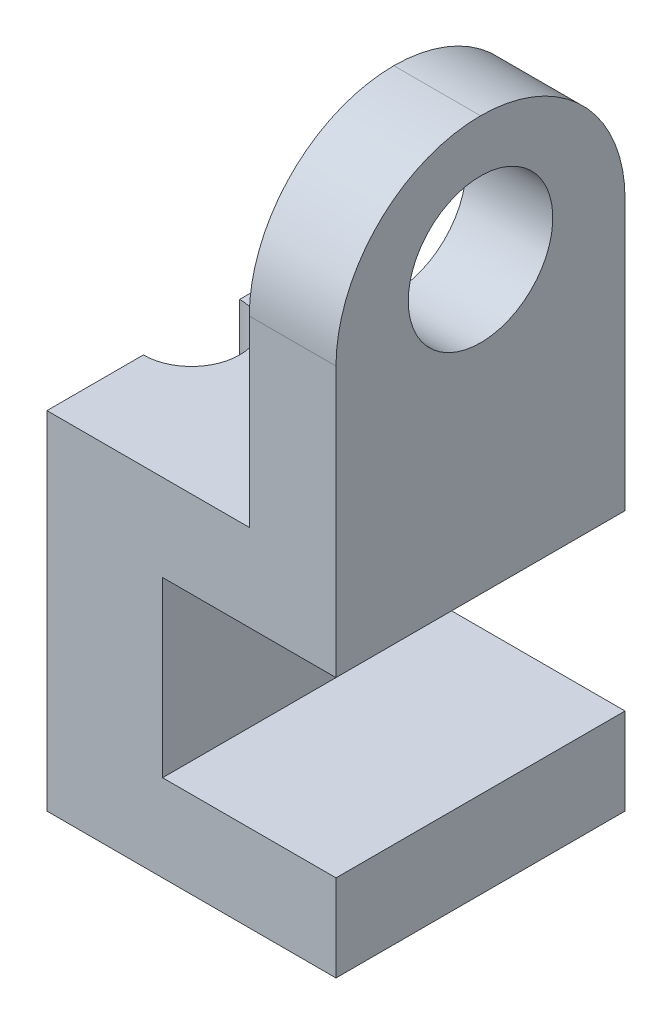
ISO-10303-21;
HEADER;
FILE_DESCRIPTION(('STEP AP214'),'2;1');
FILE_NAME('part.step','',(''),(''),'','','');
FILE_SCHEMA(('AUTOMOTIVE_DESIGN { 1 0 10303 214 1 1 1 1 }'));
ENDSEC;
DATA;
#1=APPLICATION_CONTEXT('core data for automotive mechanical design processes');
#2=APPLICATION_PROTOCOL_DEFINITION('international standard','automotive_design',2000,#1);
#3=PRODUCT_CONTEXT('',#1,'mechanical');
#4=PRODUCT('Part','Part','',(#3));
#5=PRODUCT_RELATED_PRODUCT_CATEGORY('part','',(#4));
#6=PRODUCT_DEFINITION_FORMATION('','',#4);
#7=PRODUCT_DEFINITION_CONTEXT('part definition',#1,'design');
#8=PRODUCT_DEFINITION('design','',#6,#7);
#9=PRODUCT_DEFINITION_SHAPE('','',#8);
#10=(LENGTH_UNIT() NAMED_UNIT(*) SI_UNIT(.MILLI.,.METRE.));
#11=(NAMED_UNIT(*) PLANE_ANGLE_UNIT() SI_UNIT($,.RADIAN.));
#12=(NAMED_UNIT(*) SI_UNIT($,.STERADIAN.) SOLID_ANGLE_UNIT());
#13=UNCERTAINTY_MEASURE_WITH_UNIT(LENGTH_MEASURE(1.E-05),#10,'distance_accuracy_value','');
#14=(GEOMETRIC_REPRESENTATION_CONTEXT(3) GLOBAL_UNCERTAINTY_ASSIGNED_CONTEXT((#13)) GLOBAL_UNIT_ASSIGNED_CONTEXT((#10,
#11,#12)) REPRESENTATION_CONTEXT('',''));
#15=CARTESIAN_POINT('',(0.,0.,0.));
#16=DIRECTION('',(0.,0.,1.));
#17=DIRECTION('',(1.,0.,0.));
#18=AXIS2_PLACEMENT_3D('',#15,#16,#17);
#19=CARTESIAN_POINT('',(0.,36.,0.));
#20=DIRECTION('',(0.,-1.,0.));
#21=DIRECTION('',(0.,0.,-1.));
#22=AXIS2_PLACEMENT_3D('',#19,#20,#21);
#23=PLANE('',#22);
#24=DIRECTION('',(0.,0.,1.));
#25=VECTOR('',#24,1.);
#26=CARTESIAN_POINT('',(19.7323943661972,36.,-30.));
#27=LINE('',#26,#25);
#28=CARTESIAN_POINT('',(19.7323943661972,36.,-30.));
#29=VERTEX_POINT('',#28);
#30=CARTESIAN_POINT('',(19.7323943661972,36.,0.));
#31=VERTEX_POINT('',#30);
#32=EDGE_CURVE('E142',#29,#31,#27,.T.);
#33=ORIENTED_EDGE('',*,*,#32,.F.);
#34=DIRECTION('',(-1.,0.,0.));
#35=VECTOR('',#34,1.);
#36=CARTESIAN_POINT('',(-1.26760563380282,36.,-30.));
#37=LINE('',#36,#35);
#38=CARTESIAN_POINT('',(-1.26760563380282,36.,-30.));
#39=VERTEX_POINT('',#38);
#40=EDGE_CURVE('E150',#29,#39,#37,.T.);
#41=ORIENTED_EDGE('',*,*,#40,.T.);
#42=DIRECTION('',(0.,0.,1.));
#43=VECTOR('',#42,1.);
#44=CARTESIAN_POINT('',(-1.26760563380282,36.,0.));
#45=LINE('',#44,#43);
#46=CARTESIAN_POINT('',(-1.26760563380282,36.,-20.));
#47=VERTEX_POINT('',#46);
#48=EDGE_CURVE('E151',#39,#47,#45,.T.);
#49=ORIENTED_EDGE('',*,*,#48,.T.);
#50=CARTESIAN_POINT('',(-1.26760563380282,36.,-15.));
#51=DIRECTION('',(0.,1.,0.));
#52=DIRECTION('',(0.,0.,1.));
#53=AXIS2_PLACEMENT_3D('',#50,#51,#52);
#54=CIRCLE('',#53,5.);
#55=CARTESIAN_POINT('',(-1.26760563380282,36.,-10.));
#56=VERTEX_POINT('',#55);
#57=EDGE_CURVE('E162',#56,#47,#54,.T.);
#58=ORIENTED_EDGE('',*,*,#57,.F.);
#59=CARTESIAN_POINT('',(-1.26760563380282,36.,0.));
#60=VERTEX_POINT('',#59);
#61=EDGE_CURVE('E149',#56,#60,#45,.T.);
#62=ORIENTED_EDGE('',*,*,#61,.T.);
#63=DIRECTION('',(1.,0.,0.));
#64=VECTOR('',#63,1.);
#65=CARTESIAN_POINT('',(-1.26760563380282,36.,0.));
#66=LINE('',#65,#64);
#67=EDGE_CURVE('E136',#60,#31,#66,.T.);
#68=ORIENTED_EDGE('',*,*,#67,.T.);
#69=EDGE_LOOP('',(#33,#41,#49,#58,#62,#68));
#70=FACE_BOUND('',#69,.T.);
#71=ADVANCED_FACE('F39',(#70),#23,.F.);
#72=CARTESIAN_POINT('',(-1.26760563380282,36.,0.));
#73=DIRECTION('',(1.,0.,0.));
#74=DIRECTION('',(0.,0.,-1.));
#75=AXIS2_PLACEMENT_3D('',#72,#73,#74);
#76=PLANE('',#75);
#77=DIRECTION('',(0.,0.,1.));
#78=VECTOR('',#77,1.);
#79=CARTESIAN_POINT('',(-1.26760563380282,0.,0.));
#80=LINE('',#79,#78);
#81=CARTESIAN_POINT('',(-1.26760563380282,0.,-30.));
#82=VERTEX_POINT('',#81);
#83=CARTESIAN_POINT('',(-1.26760563380282,0.,-20.));
#84=VERTEX_POINT('',#83);
#85=EDGE_CURVE('E205',#82,#84,#80,.T.);
#86=ORIENTED_EDGE('',*,*,#85,.T.);
#87=DIRECTION('',(0.,1.,0.));
#88=VECTOR('',#87,1.);
#89=CARTESIAN_POINT('',(-1.26760563380282,0.,-20.));
#90=LINE('',#89,#88);
#91=EDGE_CURVE('E170',#84,#47,#90,.T.);
#92=ORIENTED_EDGE('',*,*,#91,.T.);
#93=ORIENTED_EDGE('',*,*,#48,.F.);
#94=DIRECTION('',(0.,-1.,0.));
#95=VECTOR('',#94,1.);
#96=CARTESIAN_POINT('',(-1.26760563380282,36.,-30.));
#97=LINE('',#96,#95);
#98=EDGE_CURVE('E204',#39,#82,#97,.T.);
#99=ORIENTED_EDGE('',*,*,#98,.T.);
#100=EDGE_LOOP('',(#86,#92,#93,#99));
#101=FACE_BOUND('',#100,.T.);
#102=ADVANCED_FACE('F271',(#101),#76,.F.);
#103=CARTESIAN_POINT('',(28.7323943661972,36.,0.));
#104=DIRECTION('',(-1.,0.,0.));
#105=DIRECTION('',(0.,0.,1.));
#106=AXIS2_PLACEMENT_3D('',#103,#104,#105);
#107=PLANE('',#106);
#108=CARTESIAN_POINT('',(28.7323943661972,57.087838250565,-15.));
#109=DIRECTION('',(-1.,0.,0.));
#110=DIRECTION('',(0.,0.,1.));
#111=AXIS2_PLACEMENT_3D('',#108,#109,#110);
#112=CIRCLE('',#111,7.5);
#113=CARTESIAN_POINT('',(28.7323943661972,57.087838250565,-7.50000000000001));
#114=VERTEX_POINT('',#113);
#115=EDGE_CURVE('E156',#114,#114,#112,.T.);
#116=ORIENTED_EDGE('',*,*,#115,.T.);
#117=EDGE_LOOP('',(#116));
#118=FACE_BOUND('',#117,.T.);
#119=CARTESIAN_POINT('',(28.7323943661972,55.,-15.));
#120=DIRECTION('',(-1.,0.,0.));
#121=DIRECTION('',(0.,0.,1.));
#122=AXIS2_PLACEMENT_3D('',#119,#120,#121);
#123=CIRCLE('',#122,15.);
#124=CARTESIAN_POINT('',(28.7323943661972,55.,-30.));
#125=VERTEX_POINT('',#124);
#126=CARTESIAN_POINT('',(28.7323943661972,70.,-15.));
#127=VERTEX_POINT('',#126);
#128=EDGE_CURVE('E226',#125,#127,#123,.F.);
#129=ORIENTED_EDGE('',*,*,#128,.T.);
#130=CARTESIAN_POINT('',(28.7323943661972,55.,-15.));
#131=DIRECTION('',(-1.,0.,0.));
#132=DIRECTION('',(0.,0.,1.));
#133=AXIS2_PLACEMENT_3D('',#130,#131,#132);
#134=CIRCLE('',#133,15.);
#135=CARTESIAN_POINT('',(28.7323943661972,55.,0.));
#136=VERTEX_POINT('',#135);
#137=EDGE_CURVE('E228',#127,#136,#134,.F.);
#138=ORIENTED_EDGE('',*,*,#137,.T.);
#139=DIRECTION('',(0.,-1.,0.));
#140=VECTOR('',#139,1.);
#141=CARTESIAN_POINT('',(28.7323943661972,36.,0.));
#142=LINE('',#141,#140);
#143=CARTESIAN_POINT('',(28.7323943661972,27.,0.));
#144=VERTEX_POINT('',#143);
#145=EDGE_CURVE('E222',#136,#144,#142,.T.);
#146=ORIENTED_EDGE('',*,*,#145,.T.);
#147=DIRECTION('',(0.,0.,1.));
#148=VECTOR('',#147,1.);
#149=CARTESIAN_POINT('',(28.7323943661972,27.,-30.));
#150=LINE('',#149,#148);
#151=CARTESIAN_POINT('',(28.7323943661972,27.,-30.));
#152=VERTEX_POINT('',#151);
#153=EDGE_CURVE('E194',#152,#144,#150,.T.);
#154=ORIENTED_EDGE('',*,*,#153,.F.);
#155=DIRECTION('',(0.,-1.,0.));
#156=VECTOR('',#155,1.);
#157=CARTESIAN_POINT('',(28.7323943661972,36.,-30.));
#158=LINE('',#157,#156);
#159=EDGE_CURVE('E219',#125,#152,#158,.T.);
#160=ORIENTED_EDGE('',*,*,#159,.F.);
#161=EDGE_LOOP('',(#129,#138,#146,#154,#160));
#162=FACE_BOUND('',#161,.T.);
#163=ADVANCED_FACE('F234',(#118,#162),#107,.F.);
#164=ORIENTED_EDGE('',*,*,#61,.F.);
#165=DIRECTION('',(0.,1.,0.));
#166=VECTOR('',#165,1.);
#167=CARTESIAN_POINT('',(-1.26760563380282,0.,-10.));
#168=LINE('',#167,#166);
#169=CARTESIAN_POINT('',(-1.26760563380282,0.,-10.));
#170=VERTEX_POINT('',#169);
#171=EDGE_CURVE('E166',#56,#170,#168,.F.);
#172=ORIENTED_EDGE('',*,*,#171,.T.);
#173=CARTESIAN_POINT('',(-1.26760563380282,0.,0.));
#174=VERTEX_POINT('',#173);
#175=EDGE_CURVE('E193',#170,#174,#80,.T.);
#176=ORIENTED_EDGE('',*,*,#175,.T.);
#177=DIRECTION('',(0.,-1.,0.));
#178=VECTOR('',#177,1.);
#179=CARTESIAN_POINT('',(-1.26760563380282,36.,0.));
#180=LINE('',#179,#178);
#181=EDGE_CURVE('E224',#60,#174,#180,.T.);
#182=ORIENTED_EDGE('',*,*,#181,.F.);
#183=EDGE_LOOP('',(#164,#172,#176,#182));
#184=FACE_BOUND('',#183,.T.);
#185=ADVANCED_FACE('F274',(#184),#76,.F.);
#186=CARTESIAN_POINT('',(-1.26760563380282,36.,0.));
#187=DIRECTION('',(0.,0.,-1.));
#188=DIRECTION('',(-1.,0.,0.));
#189=AXIS2_PLACEMENT_3D('',#186,#187,#188);
#190=PLANE('',#189);
#191=ORIENTED_EDGE('',*,*,#145,.F.);
#192=DIRECTION('',(1.,0.,0.));
#193=VECTOR('',#192,1.);
#194=CARTESIAN_POINT('',(-1.26760563380282,55.,0.));
#195=LINE('',#194,#193);
#196=CARTESIAN_POINT('',(19.7323943661972,55.,0.));
#197=VERTEX_POINT('',#196);
#198=EDGE_CURVE('E139',#136,#197,#195,.F.);
#199=ORIENTED_EDGE('',*,*,#198,.T.);
#200=DIRECTION('',(0.,-1.,0.));
#201=VECTOR('',#200,1.);
#202=CARTESIAN_POINT('',(19.7323943661972,70.,0.));
#203=LINE('',#202,#201);
#204=EDGE_CURVE('E131',#197,#31,#203,.T.);
#205=ORIENTED_EDGE('',*,*,#204,.T.);
#206=ORIENTED_EDGE('',*,*,#67,.F.);
#207=ORIENTED_EDGE('',*,*,#181,.T.);
#208=DIRECTION('',(1.,0.,0.));
#209=VECTOR('',#208,1.);
#210=CARTESIAN_POINT('',(-1.26760563380282,0.,0.));
#211=LINE('',#210,#209);
#212=CARTESIAN_POINT('',(28.7323943661972,0.,0.));
#213=VERTEX_POINT('',#212);
#214=EDGE_CURVE('E208',#174,#213,#211,.T.);
#215=ORIENTED_EDGE('',*,*,#214,.T.);
#216=CARTESIAN_POINT('',(28.7323943661972,8.99999999999999,0.));
#217=VERTEX_POINT('',#216);
#218=EDGE_CURVE('E221',#217,#213,#142,.T.);
#219=ORIENTED_EDGE('',*,*,#218,.F.);
#220=DIRECTION('',(1.,0.,0.));
#221=VECTOR('',#220,1.);
#222=CARTESIAN_POINT('',(28.7323943661972,8.99999999999999,0.));
#223=LINE('',#222,#221);
#224=CARTESIAN_POINT('',(10.7323943661972,8.99999999999999,0.));
#225=VERTEX_POINT('',#224);
#226=EDGE_CURVE('E187',#225,#217,#223,.T.);
#227=ORIENTED_EDGE('',*,*,#226,.F.);
#228=DIRECTION('',(0.,-1.,0.));
#229=VECTOR('',#228,1.);
#230=CARTESIAN_POINT('',(10.7323943661972,8.99999999999999,0.));
#231=LINE('',#230,#229);
#232=CARTESIAN_POINT('',(10.7323943661972,27.,0.));
#233=VERTEX_POINT('',#232);
#234=EDGE_CURVE('E173',#233,#225,#231,.T.);
#235=ORIENTED_EDGE('',*,*,#234,.F.);
#236=DIRECTION('',(-1.,0.,0.));
#237=VECTOR('',#236,1.);
#238=CARTESIAN_POINT('',(28.7323943661972,27.,0.));
#239=LINE('',#238,#237);
#240=EDGE_CURVE('E178',#144,#233,#239,.T.);
#241=ORIENTED_EDGE('',*,*,#240,.F.);
#242=EDGE_LOOP('',(#191,#199,#205,#206,#207,#215,#219,#227,#235,#241));
#243=FACE_BOUND('',#242,.T.);
#244=ADVANCED_FACE('F134',(#243),#190,.F.);
#245=CARTESIAN_POINT('',(28.7323943661972,8.99999999999999,-30.));
#246=VERTEX_POINT('',#245);
#247=CARTESIAN_POINT('',(28.7323943661972,0.,-30.));
#248=VERTEX_POINT('',#247);
#249=EDGE_CURVE('E218',#246,#248,#158,.T.);
#250=ORIENTED_EDGE('',*,*,#249,.F.);
#251=DIRECTION('',(0.,0.,1.));
#252=VECTOR('',#251,1.);
#253=CARTESIAN_POINT('',(28.7323943661972,8.99999999999999,-30.));
#254=LINE('',#253,#252);
#255=EDGE_CURVE('E197',#246,#217,#254,.T.);
#256=ORIENTED_EDGE('',*,*,#255,.T.);
#257=ORIENTED_EDGE('',*,*,#218,.T.);
#258=DIRECTION('',(0.,0.,-1.));
#259=VECTOR('',#258,1.);
#260=CARTESIAN_POINT('',(28.7323943661972,0.,0.));
#261=LINE('',#260,#259);
#262=EDGE_CURVE('E211',#213,#248,#261,.T.);
#263=ORIENTED_EDGE('',*,*,#262,.T.);
#264=EDGE_LOOP('',(#250,#256,#257,#263));
#265=FACE_BOUND('',#264,.T.);
#266=ADVANCED_FACE('F260',(#265),#107,.F.);
#267=CARTESIAN_POINT('',(-1.26760563380282,36.,-30.));
#268=DIRECTION('',(0.,0.,1.));
#269=DIRECTION('',(1.,0.,0.));
#270=AXIS2_PLACEMENT_3D('',#267,#268,#269);
#271=PLANE('',#270);
#272=DIRECTION('',(0.,-1.,0.));
#273=VECTOR('',#272,1.);
#274=CARTESIAN_POINT('',(19.7323943661972,70.,-30.));
#275=LINE('',#274,#273);
#276=CARTESIAN_POINT('',(19.7323943661972,55.,-30.));
#277=VERTEX_POINT('',#276);
#278=EDGE_CURVE('E141',#277,#29,#275,.T.);
#279=ORIENTED_EDGE('',*,*,#278,.F.);
#280=DIRECTION('',(-1.,0.,0.));
#281=VECTOR('',#280,1.);
#282=CARTESIAN_POINT('',(-1.26760563380282,55.,-30.));
#283=LINE('',#282,#281);
#284=EDGE_CURVE('E11',#277,#125,#283,.F.);
#285=ORIENTED_EDGE('',*,*,#284,.T.);
#286=ORIENTED_EDGE('',*,*,#159,.T.);
#287=DIRECTION('',(-1.,0.,0.));
#288=VECTOR('',#287,1.);
#289=CARTESIAN_POINT('',(28.7323943661972,27.,-30.));
#290=LINE('',#289,#288);
#291=CARTESIAN_POINT('',(10.7323943661972,27.,-30.));
#292=VERTEX_POINT('',#291);
#293=EDGE_CURVE('E181',#152,#292,#290,.T.);
#294=ORIENTED_EDGE('',*,*,#293,.T.);
#295=DIRECTION('',(0.,-1.,0.));
#296=VECTOR('',#295,1.);
#297=CARTESIAN_POINT('',(10.7323943661972,8.99999999999999,-30.));
#298=LINE('',#297,#296);
#299=CARTESIAN_POINT('',(10.7323943661972,8.99999999999999,-30.));
#300=VERTEX_POINT('',#299);
#301=EDGE_CURVE('E174',#292,#300,#298,.T.);
#302=ORIENTED_EDGE('',*,*,#301,.T.);
#303=DIRECTION('',(1.,0.,0.));
#304=VECTOR('',#303,1.);
#305=CARTESIAN_POINT('',(28.7323943661972,8.99999999999999,-30.));
#306=LINE('',#305,#304);
#307=EDGE_CURVE('E177',#300,#246,#306,.T.);
#308=ORIENTED_EDGE('',*,*,#307,.T.);
#309=ORIENTED_EDGE('',*,*,#249,.T.);
#310=DIRECTION('',(-1.,0.,0.));
#311=VECTOR('',#310,1.);
#312=CARTESIAN_POINT('',(-1.26760563380282,0.,-30.));
#313=LINE('',#312,#311);
#314=EDGE_CURVE('E214',#248,#82,#313,.T.);
#315=ORIENTED_EDGE('',*,*,#314,.T.);
#316=ORIENTED_EDGE('',*,*,#98,.F.);
#317=ORIENTED_EDGE('',*,*,#40,.F.);
#318=EDGE_LOOP('',(#279,#285,#286,#294,#302,#308,#309,#315,#316,#317));
#319=FACE_BOUND('',#318,.T.);
#320=ADVANCED_FACE('F246',(#319),#271,.F.);
#321=CARTESIAN_POINT('',(0.,0.,0.));
#322=DIRECTION('',(0.,-1.,0.));
#323=DIRECTION('',(0.,0.,-1.));
#324=AXIS2_PLACEMENT_3D('',#321,#322,#323);
#325=PLANE('',#324);
#326=CARTESIAN_POINT('',(-1.26760563380282,0.,-15.));
#327=DIRECTION('',(0.,1.,0.));
#328=DIRECTION('',(0.,0.,1.));
#329=AXIS2_PLACEMENT_3D('',#326,#327,#328);
#330=CIRCLE('',#329,5.);
#331=EDGE_CURVE('E163',#170,#84,#330,.T.);
#332=ORIENTED_EDGE('',*,*,#331,.T.);
#333=ORIENTED_EDGE('',*,*,#85,.F.);
#334=ORIENTED_EDGE('',*,*,#314,.F.);
#335=ORIENTED_EDGE('',*,*,#262,.F.);
#336=ORIENTED_EDGE('',*,*,#214,.F.);
#337=ORIENTED_EDGE('',*,*,#175,.F.);
#338=EDGE_LOOP('',(#332,#333,#334,#335,#336,#337));
#339=FACE_BOUND('',#338,.T.);
#340=ADVANCED_FACE('F266',(#339),#325,.T.);
#341=CARTESIAN_POINT('',(10.7323943661972,8.99999999999999,-30.));
#342=DIRECTION('',(-1.,0.,0.));
#343=DIRECTION('',(0.,0.,1.));
#344=AXIS2_PLACEMENT_3D('',#341,#342,#343);
#345=PLANE('',#344);
#346=ORIENTED_EDGE('',*,*,#234,.T.);
#347=DIRECTION('',(0.,0.,1.));
#348=VECTOR('',#347,1.);
#349=CARTESIAN_POINT('',(10.7323943661972,8.99999999999999,-30.));
#350=LINE('',#349,#348);
#351=EDGE_CURVE('E184',#300,#225,#350,.T.);
#352=ORIENTED_EDGE('',*,*,#351,.F.);
#353=ORIENTED_EDGE('',*,*,#301,.F.);
#354=DIRECTION('',(0.,0.,1.));
#355=VECTOR('',#354,1.);
#356=CARTESIAN_POINT('',(10.7323943661972,27.,-30.));
#357=LINE('',#356,#355);
#358=EDGE_CURVE('E191',#292,#233,#357,.T.);
#359=ORIENTED_EDGE('',*,*,#358,.T.);
#360=EDGE_LOOP('',(#346,#352,#353,#359));
#361=FACE_BOUND('',#360,.T.);
#362=ADVANCED_FACE('F254',(#361),#345,.F.);
#363=CARTESIAN_POINT('',(28.7323943661972,27.,-30.));
#364=DIRECTION('',(0.,1.,0.));
#365=DIRECTION('',(0.,0.,1.));
#366=AXIS2_PLACEMENT_3D('',#363,#364,#365);
#367=PLANE('',#366);
#368=ORIENTED_EDGE('',*,*,#240,.T.);
#369=ORIENTED_EDGE('',*,*,#358,.F.);
#370=ORIENTED_EDGE('',*,*,#293,.F.);
#371=ORIENTED_EDGE('',*,*,#153,.T.);
#372=EDGE_LOOP('',(#368,#369,#370,#371));
#373=FACE_BOUND('',#372,.T.);
#374=ADVANCED_FACE('F249',(#373),#367,.F.);
#375=CARTESIAN_POINT('',(28.7323943661972,8.99999999999999,-30.));
#376=DIRECTION('',(0.,-1.,0.));
#377=DIRECTION('',(1.,0.,0.));
#378=AXIS2_PLACEMENT_3D('',#375,#376,#377);
#379=PLANE('',#378);
#380=ORIENTED_EDGE('',*,*,#226,.T.);
#381=ORIENTED_EDGE('',*,*,#255,.F.);
#382=ORIENTED_EDGE('',*,*,#307,.F.);
#383=ORIENTED_EDGE('',*,*,#351,.T.);
#384=EDGE_LOOP('',(#380,#381,#382,#383));
#385=FACE_BOUND('',#384,.T.);
#386=ADVANCED_FACE('F257',(#385),#379,.F.);
#387=CARTESIAN_POINT('',(-1.26760563380282,0.,-15.));
#388=DIRECTION('',(0.,1.,0.));
#389=DIRECTION('',(0.,0.,1.));
#390=AXIS2_PLACEMENT_3D('',#387,#388,#389);
#391=CYLINDRICAL_SURFACE('',#390,5.);
#392=ORIENTED_EDGE('',*,*,#331,.F.);
#393=ORIENTED_EDGE('',*,*,#171,.F.);
#394=ORIENTED_EDGE('',*,*,#57,.T.);
#395=ORIENTED_EDGE('',*,*,#91,.F.);
#396=EDGE_LOOP('',(#392,#393,#394,#395));
#397=FACE_BOUND('',#396,.T.);
#398=ADVANCED_FACE('F275',(#397),#391,.F.);
#399=CARTESIAN_POINT('',(19.7323943661972,70.,-30.));
#400=DIRECTION('',(1.,0.,0.));
#401=DIRECTION('',(0.,0.,-1.));
#402=AXIS2_PLACEMENT_3D('',#399,#400,#401);
#403=PLANE('',#402);
#404=CARTESIAN_POINT('',(19.7323943661972,57.087838250565,-15.));
#405=DIRECTION('',(-1.,0.,0.));
#406=DIRECTION('',(0.,0.,1.));
#407=AXIS2_PLACEMENT_3D('',#404,#405,#406);
#408=CIRCLE('',#407,7.5);
#409=CARTESIAN_POINT('',(19.7323943661972,57.087838250565,-7.50000000000001));
#410=VERTEX_POINT('',#409);
#411=EDGE_CURVE('E158',#410,#410,#408,.T.);
#412=ORIENTED_EDGE('',*,*,#411,.F.);
#413=EDGE_LOOP('',(#412));
#414=FACE_BOUND('',#413,.T.);
#415=ORIENTED_EDGE('',*,*,#204,.F.);
#416=CARTESIAN_POINT('',(19.7323943661972,55.,-15.));
#417=DIRECTION('',(1.,0.,0.));
#418=DIRECTION('',(0.,0.,-1.));
#419=AXIS2_PLACEMENT_3D('',#416,#417,#418);
#420=CIRCLE('',#419,15.);
#421=CARTESIAN_POINT('',(19.7323943661972,70.,-15.));
#422=VERTEX_POINT('',#421);
#423=EDGE_CURVE('E48',#197,#422,#420,.F.);
#424=ORIENTED_EDGE('',*,*,#423,.T.);
#425=CARTESIAN_POINT('',(19.7323943661972,55.,-15.));
#426=DIRECTION('',(1.,0.,0.));
#427=DIRECTION('',(0.,0.,-1.));
#428=AXIS2_PLACEMENT_3D('',#425,#426,#427);
#429=CIRCLE('',#428,15.);
#430=EDGE_CURVE('E55',#422,#277,#429,.F.);
#431=ORIENTED_EDGE('',*,*,#430,.T.);
#432=ORIENTED_EDGE('',*,*,#278,.T.);
#433=ORIENTED_EDGE('',*,*,#32,.T.);
#434=EDGE_LOOP('',(#415,#424,#431,#432,#433));
#435=FACE_BOUND('',#434,.T.);
#436=ADVANCED_FACE('F153',(#414,#435),#403,.F.);
#437=CARTESIAN_POINT('',(0.,55.,-15.));
#438=DIRECTION('',(-1.,0.,0.));
#439=DIRECTION('',(0.,0.,1.));
#440=AXIS2_PLACEMENT_3D('',#437,#438,#439);
#441=CYLINDRICAL_SURFACE('',#440,15.);
#442=ORIENTED_EDGE('',*,*,#284,.F.);
#443=ORIENTED_EDGE('',*,*,#430,.F.);
#444=DIRECTION('',(-1.,0.,0.));
#445=VECTOR('',#444,1.);
#446=CARTESIAN_POINT('',(0.,70.,-15.));
#447=LINE('',#446,#445);
#448=EDGE_CURVE('E43',#127,#422,#447,.T.);
#449=ORIENTED_EDGE('',*,*,#448,.F.);
#450=ORIENTED_EDGE('',*,*,#128,.F.);
#451=EDGE_LOOP('',(#442,#443,#449,#450));
#452=FACE_BOUND('',#451,.T.);
#453=ADVANCED_FACE('F41',(#452),#441,.T.);
#454=CARTESIAN_POINT('',(0.,55.,-15.));
#455=DIRECTION('',(1.,0.,0.));
#456=DIRECTION('',(0.,0.,-1.));
#457=AXIS2_PLACEMENT_3D('',#454,#455,#456);
#458=CYLINDRICAL_SURFACE('',#457,15.);
#459=ORIENTED_EDGE('',*,*,#423,.F.);
#460=ORIENTED_EDGE('',*,*,#198,.F.);
#461=ORIENTED_EDGE('',*,*,#137,.F.);
#462=ORIENTED_EDGE('',*,*,#448,.T.);
#463=EDGE_LOOP('',(#459,#460,#461,#462));
#464=FACE_BOUND('',#463,.T.);
#465=ADVANCED_FACE('F242',(#464),#458,.T.);
#466=CARTESIAN_POINT('',(28.7323943661972,57.087838250565,-15.));
#467=DIRECTION('',(-1.,0.,0.));
#468=DIRECTION('',(0.,0.,1.));
#469=AXIS2_PLACEMENT_3D('',#466,#467,#468);
#470=CYLINDRICAL_SURFACE('',#469,7.5);
#471=ORIENTED_EDGE('',*,*,#115,.F.);
#472=EDGE_LOOP('',(#471));
#473=FACE_BOUND('',#472,.T.);
#474=ORIENTED_EDGE('',*,*,#411,.T.);
#475=EDGE_LOOP('',(#474));
#476=FACE_BOUND('',#475,.T.);
#477=ADVANCED_FACE('F303',(#473,#476),#470,.F.);
#478=CLOSED_SHELL('',(#71,#102,#163,#185,#244,#266,#320,#340,#362,#374,#386,#398,#436,#453,#465,#477));
#479=MANIFOLD_SOLID_BREP('B2',#478);
#480=ADVANCED_BREP_SHAPE_REPRESENTATION('',(#18,#479),#14);
#481=SHAPE_DEFINITION_REPRESENTATION(#9,#480);
ENDSEC;
END-ISO-10303-21;
